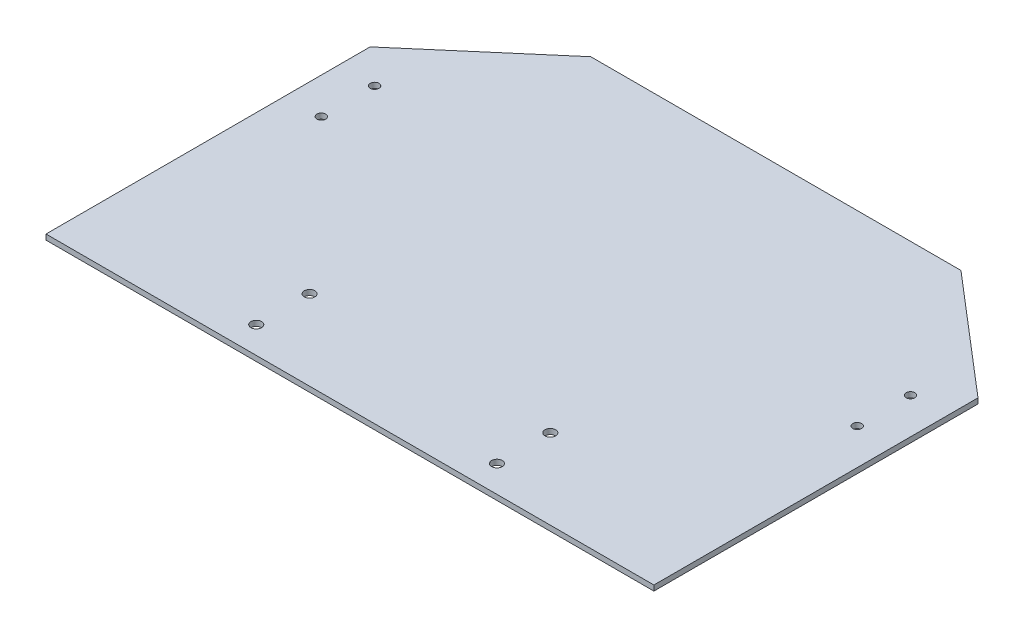
ISO-10303-21;
HEADER;
FILE_DESCRIPTION(('STEP AP214'),'2;1');
FILE_NAME('part.step','',(''),(''),'','','');
FILE_SCHEMA(('AUTOMOTIVE_DESIGN { 1 0 10303 214 1 1 1 1 }'));
ENDSEC;
DATA;
#1=APPLICATION_CONTEXT('core data for automotive mechanical design processes');
#2=APPLICATION_PROTOCOL_DEFINITION('international standard','automotive_design',2000,#1);
#3=PRODUCT_CONTEXT('',#1,'mechanical');
#4=PRODUCT('Part','Part','',(#3));
#5=PRODUCT_RELATED_PRODUCT_CATEGORY('part','',(#4));
#6=PRODUCT_DEFINITION_FORMATION('','',#4);
#7=PRODUCT_DEFINITION_CONTEXT('part definition',#1,'design');
#8=PRODUCT_DEFINITION('design','',#6,#7);
#9=PRODUCT_DEFINITION_SHAPE('','',#8);
#10=(LENGTH_UNIT() NAMED_UNIT(*) SI_UNIT(.MILLI.,.METRE.));
#11=(NAMED_UNIT(*) PLANE_ANGLE_UNIT() SI_UNIT($,.RADIAN.));
#12=(NAMED_UNIT(*) SI_UNIT($,.STERADIAN.) SOLID_ANGLE_UNIT());
#13=UNCERTAINTY_MEASURE_WITH_UNIT(LENGTH_MEASURE(1.E-05),#10,'distance_accuracy_value','');
#14=(GEOMETRIC_REPRESENTATION_CONTEXT(3) GLOBAL_UNCERTAINTY_ASSIGNED_CONTEXT((#13)) GLOBAL_UNIT_ASSIGNED_CONTEXT((#10,
#11,#12)) REPRESENTATION_CONTEXT('',''));
#15=CARTESIAN_POINT('',(0.,0.,0.));
#16=DIRECTION('',(0.,0.,1.));
#17=DIRECTION('',(1.,0.,0.));
#18=AXIS2_PLACEMENT_3D('',#15,#16,#17);
#19=CARTESIAN_POINT('',(0.,2.,-79.875));
#20=DIRECTION('',(0.,0.,-1.));
#21=DIRECTION('',(-1.,0.,0.));
#22=AXIS2_PLACEMENT_3D('',#19,#20,#21);
#23=PLANE('',#22);
#24=DIRECTION('',(1.,0.,0.));
#25=VECTOR('',#24,1.);
#26=CARTESIAN_POINT('',(0.,0.,-79.875));
#27=LINE('',#26,#25);
#28=CARTESIAN_POINT('',(-69.415,0.,-79.875));
#29=VERTEX_POINT('',#28);
#30=CARTESIAN_POINT('',(69.415,0.,-79.875));
#31=VERTEX_POINT('',#30);
#32=EDGE_CURVE('E128',#29,#31,#27,.T.);
#33=ORIENTED_EDGE('',*,*,#32,.F.);
#34=DIRECTION('',(0.,-1.,0.));
#35=VECTOR('',#34,1.);
#36=CARTESIAN_POINT('',(-69.415,2.,-79.875));
#37=LINE('',#36,#35);
#38=CARTESIAN_POINT('',(-69.415,2.,-79.875));
#39=VERTEX_POINT('',#38);
#40=EDGE_CURVE('E11',#39,#29,#37,.T.);
#41=ORIENTED_EDGE('',*,*,#40,.F.);
#42=DIRECTION('',(1.,0.,0.));
#43=VECTOR('',#42,1.);
#44=CARTESIAN_POINT('',(0.,2.,-79.875));
#45=LINE('',#44,#43);
#46=CARTESIAN_POINT('',(69.415,2.,-79.875));
#47=VERTEX_POINT('',#46);
#48=EDGE_CURVE('E137',#39,#47,#45,.T.);
#49=ORIENTED_EDGE('',*,*,#48,.T.);
#50=DIRECTION('',(0.,-1.,0.));
#51=VECTOR('',#50,1.);
#52=CARTESIAN_POINT('',(69.415,2.,-79.875));
#53=LINE('',#52,#51);
#54=EDGE_CURVE('E63',#47,#31,#53,.T.);
#55=ORIENTED_EDGE('',*,*,#54,.T.);
#56=EDGE_LOOP('',(#33,#41,#49,#55));
#57=FACE_BOUND('',#56,.T.);
#58=ADVANCED_FACE('F43',(#57),#23,.T.);
#59=CARTESIAN_POINT('',(-68.8400569146173,2.,-80.3674767619326));
#60=DIRECTION('',(0.650538829440786,0.,0.759472995826588));
#61=DIRECTION('',(0.759472995826588,0.,-0.650538829440786));
#62=AXIS2_PLACEMENT_3D('',#59,#60,#61);
#63=PLANE('',#62);
#64=DIRECTION('',(-0.759472995826588,0.,0.650538829440786));
#65=VECTOR('',#64,1.);
#66=CARTESIAN_POINT('',(-68.8400569146173,0.,-80.3674767619326));
#67=LINE('',#66,#65);
#68=CARTESIAN_POINT('',(-114.,0.,-41.6849999999999));
#69=VERTEX_POINT('',#68);
#70=EDGE_CURVE('E127',#29,#69,#67,.T.);
#71=ORIENTED_EDGE('',*,*,#70,.T.);
#72=DIRECTION('',(0.,-1.,0.));
#73=VECTOR('',#72,1.);
#74=CARTESIAN_POINT('',(-114.,2.,-41.6849999999999));
#75=LINE('',#74,#73);
#76=CARTESIAN_POINT('',(-114.,2.,-41.6849999999999));
#77=VERTEX_POINT('',#76);
#78=EDGE_CURVE('E55',#77,#69,#75,.T.);
#79=ORIENTED_EDGE('',*,*,#78,.F.);
#80=DIRECTION('',(-0.759472995826588,0.,0.650538829440786));
#81=VECTOR('',#80,1.);
#82=CARTESIAN_POINT('',(-68.8400569146173,2.,-80.3674767619326));
#83=LINE('',#82,#81);
#84=EDGE_CURVE('E206',#39,#77,#83,.T.);
#85=ORIENTED_EDGE('',*,*,#84,.F.);
#86=ORIENTED_EDGE('',*,*,#40,.T.);
#87=EDGE_LOOP('',(#71,#79,#85,#86));
#88=FACE_BOUND('',#87,.T.);
#89=ADVANCED_FACE('F179',(#88),#63,.F.);
#90=CARTESIAN_POINT('',(-114.,2.,0.));
#91=DIRECTION('',(-1.,0.,0.));
#92=DIRECTION('',(0.,0.,1.));
#93=AXIS2_PLACEMENT_3D('',#90,#91,#92);
#94=PLANE('',#93);
#95=DIRECTION('',(0.,0.,-1.));
#96=VECTOR('',#95,1.);
#97=CARTESIAN_POINT('',(-114.,0.,0.));
#98=LINE('',#97,#96);
#99=CARTESIAN_POINT('',(-114.,0.,79.875));
#100=VERTEX_POINT('',#99);
#101=EDGE_CURVE('E131',#100,#69,#98,.T.);
#102=ORIENTED_EDGE('',*,*,#101,.F.);
#103=DIRECTION('',(0.,-1.,0.));
#104=VECTOR('',#103,1.);
#105=CARTESIAN_POINT('',(-114.,2.,79.875));
#106=LINE('',#105,#104);
#107=CARTESIAN_POINT('',(-114.,2.,79.875));
#108=VERTEX_POINT('',#107);
#109=EDGE_CURVE('E117',#108,#100,#106,.T.);
#110=ORIENTED_EDGE('',*,*,#109,.F.);
#111=DIRECTION('',(0.,0.,-1.));
#112=VECTOR('',#111,1.);
#113=CARTESIAN_POINT('',(-114.,2.,0.));
#114=LINE('',#113,#112);
#115=EDGE_CURVE('E108',#108,#77,#114,.T.);
#116=ORIENTED_EDGE('',*,*,#115,.T.);
#117=ORIENTED_EDGE('',*,*,#78,.T.);
#118=EDGE_LOOP('',(#102,#110,#116,#117));
#119=FACE_BOUND('',#118,.T.);
#120=ADVANCED_FACE('F183',(#119),#94,.T.);
#121=CARTESIAN_POINT('',(0.,2.,79.875));
#122=DIRECTION('',(0.,0.,-1.));
#123=DIRECTION('',(-1.,0.,0.));
#124=AXIS2_PLACEMENT_3D('',#121,#122,#123);
#125=PLANE('',#124);
#126=DIRECTION('',(1.,0.,0.));
#127=VECTOR('',#126,1.);
#128=CARTESIAN_POINT('',(0.,0.,79.875));
#129=LINE('',#128,#127);
#130=CARTESIAN_POINT('',(114.,0.,79.875));
#131=VERTEX_POINT('',#130);
#132=EDGE_CURVE('E114',#100,#131,#129,.T.);
#133=ORIENTED_EDGE('',*,*,#132,.T.);
#134=DIRECTION('',(0.,-1.,0.));
#135=VECTOR('',#134,1.);
#136=CARTESIAN_POINT('',(114.,2.,79.875));
#137=LINE('',#136,#135);
#138=CARTESIAN_POINT('',(114.,2.,79.875));
#139=VERTEX_POINT('',#138);
#140=EDGE_CURVE('E115',#139,#131,#137,.T.);
#141=ORIENTED_EDGE('',*,*,#140,.F.);
#142=DIRECTION('',(1.,0.,0.));
#143=VECTOR('',#142,1.);
#144=CARTESIAN_POINT('',(0.,2.,79.875));
#145=LINE('',#144,#143);
#146=EDGE_CURVE('E99',#108,#139,#145,.T.);
#147=ORIENTED_EDGE('',*,*,#146,.F.);
#148=ORIENTED_EDGE('',*,*,#109,.T.);
#149=EDGE_LOOP('',(#133,#141,#147,#148));
#150=FACE_BOUND('',#149,.T.);
#151=ADVANCED_FACE('F113',(#150),#125,.F.);
#152=CARTESIAN_POINT('',(114.,2.,0.));
#153=DIRECTION('',(-1.,0.,0.));
#154=DIRECTION('',(0.,0.,1.));
#155=AXIS2_PLACEMENT_3D('',#152,#153,#154);
#156=PLANE('',#155);
#157=DIRECTION('',(0.,0.,-1.));
#158=VECTOR('',#157,1.);
#159=CARTESIAN_POINT('',(114.,0.,0.));
#160=LINE('',#159,#158);
#161=CARTESIAN_POINT('',(114.,0.,-41.685));
#162=VERTEX_POINT('',#161);
#163=EDGE_CURVE('E134',#131,#162,#160,.T.);
#164=ORIENTED_EDGE('',*,*,#163,.T.);
#165=DIRECTION('',(0.,-1.,0.));
#166=VECTOR('',#165,1.);
#167=CARTESIAN_POINT('',(114.,2.,-41.685));
#168=LINE('',#167,#166);
#169=CARTESIAN_POINT('',(114.,2.,-41.685));
#170=VERTEX_POINT('',#169);
#171=EDGE_CURVE('E83',#170,#162,#168,.T.);
#172=ORIENTED_EDGE('',*,*,#171,.F.);
#173=DIRECTION('',(0.,0.,-1.));
#174=VECTOR('',#173,1.);
#175=CARTESIAN_POINT('',(114.,2.,0.));
#176=LINE('',#175,#174);
#177=EDGE_CURVE('E106',#139,#170,#176,.T.);
#178=ORIENTED_EDGE('',*,*,#177,.F.);
#179=ORIENTED_EDGE('',*,*,#140,.T.);
#180=EDGE_LOOP('',(#164,#172,#178,#179));
#181=FACE_BOUND('',#180,.T.);
#182=ADVANCED_FACE('F119',(#181),#156,.F.);
#183=CARTESIAN_POINT('',(68.8400569146173,2.,-80.3674767619326));
#184=DIRECTION('',(0.650538829440786,0.,-0.759472995826588));
#185=DIRECTION('',(-0.759472995826588,0.,-0.650538829440786));
#186=AXIS2_PLACEMENT_3D('',#183,#184,#185);
#187=PLANE('',#186);
#188=DIRECTION('',(0.759472995826588,0.,0.650538829440786));
#189=VECTOR('',#188,1.);
#190=CARTESIAN_POINT('',(68.8400569146173,0.,-80.3674767619326));
#191=LINE('',#190,#189);
#192=EDGE_CURVE('E140',#31,#162,#191,.T.);
#193=ORIENTED_EDGE('',*,*,#192,.F.);
#194=ORIENTED_EDGE('',*,*,#54,.F.);
#195=DIRECTION('',(0.759472995826588,0.,0.650538829440786));
#196=VECTOR('',#195,1.);
#197=CARTESIAN_POINT('',(68.8400569146173,2.,-80.3674767619326));
#198=LINE('',#197,#196);
#199=EDGE_CURVE('E122',#47,#170,#198,.T.);
#200=ORIENTED_EDGE('',*,*,#199,.T.);
#201=ORIENTED_EDGE('',*,*,#171,.T.);
#202=EDGE_LOOP('',(#193,#194,#200,#201));
#203=FACE_BOUND('',#202,.T.);
#204=ADVANCED_FACE('F189',(#203),#187,.T.);
#205=CARTESIAN_POINT('',(0.,2.,0.));
#206=DIRECTION('',(0.,1.,0.));
#207=DIRECTION('',(0.,0.,1.));
#208=AXIS2_PLACEMENT_3D('',#205,#206,#207);
#209=PLANE('',#208);
#210=CARTESIAN_POINT('',(100.499999999999,2.,-9.87699826613501));
#211=DIRECTION('',(0.,1.,0.));
#212=DIRECTION('',(0.,0.,1.));
#213=AXIS2_PLACEMENT_3D('',#210,#211,#212);
#214=CIRCLE('',#213,1.64999999999999);
#215=CARTESIAN_POINT('',(100.499999999999,2.,-8.22699826613502));
#216=VERTEX_POINT('',#215);
#217=EDGE_CURVE('E228',#216,#216,#214,.T.);
#218=ORIENTED_EDGE('',*,*,#217,.F.);
#219=EDGE_LOOP('',(#218));
#220=FACE_BOUND('',#219,.T.);
#221=CARTESIAN_POINT('',(-100.500000000001,2.,-29.876998266135));
#222=DIRECTION('',(0.,1.,0.));
#223=DIRECTION('',(0.,0.,1.));
#224=AXIS2_PLACEMENT_3D('',#221,#222,#223);
#225=CIRCLE('',#224,1.65);
#226=CARTESIAN_POINT('',(-100.500000000001,2.,-28.226998266135));
#227=VERTEX_POINT('',#226);
#228=EDGE_CURVE('E235',#227,#227,#225,.T.);
#229=ORIENTED_EDGE('',*,*,#228,.F.);
#230=EDGE_LOOP('',(#229));
#231=FACE_BOUND('',#230,.T.);
#232=CARTESIAN_POINT('',(-100.500000000001,2.,-9.87699826613501));
#233=DIRECTION('',(0.,1.,0.));
#234=DIRECTION('',(0.,0.,1.));
#235=AXIS2_PLACEMENT_3D('',#232,#233,#234);
#236=CIRCLE('',#235,1.64999999999999);
#237=CARTESIAN_POINT('',(-100.500000000001,2.,-8.22699826613503));
#238=VERTEX_POINT('',#237);
#239=EDGE_CURVE('E231',#238,#238,#236,.T.);
#240=ORIENTED_EDGE('',*,*,#239,.F.);
#241=EDGE_LOOP('',(#240));
#242=FACE_BOUND('',#241,.T.);
#243=CARTESIAN_POINT('',(100.499999999999,2.,-29.876998266135));
#244=DIRECTION('',(0.,1.,0.));
#245=DIRECTION('',(0.,0.,1.));
#246=AXIS2_PLACEMENT_3D('',#243,#244,#245);
#247=CIRCLE('',#246,1.64999999999999);
#248=CARTESIAN_POINT('',(100.499999999999,2.,-28.226998266135));
#249=VERTEX_POINT('',#248);
#250=EDGE_CURVE('E221',#249,#249,#247,.T.);
#251=ORIENTED_EDGE('',*,*,#250,.F.);
#252=EDGE_LOOP('',(#251));
#253=FACE_BOUND('',#252,.T.);
#254=CARTESIAN_POINT('',(45.14,2.,69.875));
#255=DIRECTION('',(0.,1.,0.));
#256=DIRECTION('',(0.,0.,1.));
#257=AXIS2_PLACEMENT_3D('',#254,#255,#256);
#258=CIRCLE('',#257,2.);
#259=CARTESIAN_POINT('',(45.14,2.,71.8750000000001));
#260=VERTEX_POINT('',#259);
#261=EDGE_CURVE('E215',#260,#260,#258,.T.);
#262=ORIENTED_EDGE('',*,*,#261,.F.);
#263=EDGE_LOOP('',(#262));
#264=FACE_BOUND('',#263,.T.);
#265=CARTESIAN_POINT('',(-45.1400000000012,2.,49.8749999999996));
#266=DIRECTION('',(0.,1.,0.));
#267=DIRECTION('',(0.,0.,1.));
#268=AXIS2_PLACEMENT_3D('',#265,#266,#267);
#269=CIRCLE('',#268,2.);
#270=CARTESIAN_POINT('',(-45.1400000000012,2.,51.8749999999996));
#271=VERTEX_POINT('',#270);
#272=EDGE_CURVE('E211',#271,#271,#269,.T.);
#273=ORIENTED_EDGE('',*,*,#272,.F.);
#274=EDGE_LOOP('',(#273));
#275=FACE_BOUND('',#274,.T.);
#276=CARTESIAN_POINT('',(45.1400000000015,2.,49.8749999999994));
#277=DIRECTION('',(0.,1.,0.));
#278=DIRECTION('',(0.,0.,-1.));
#279=AXIS2_PLACEMENT_3D('',#276,#277,#278);
#280=CIRCLE('',#279,2.);
#281=CARTESIAN_POINT('',(45.1400000000015,2.,47.8749999999994));
#282=VERTEX_POINT('',#281);
#283=EDGE_CURVE('E217',#282,#282,#280,.T.);
#284=ORIENTED_EDGE('',*,*,#283,.F.);
#285=EDGE_LOOP('',(#284));
#286=FACE_BOUND('',#285,.T.);
#287=CARTESIAN_POINT('',(-45.14,2.,69.875));
#288=DIRECTION('',(0.,1.,0.));
#289=DIRECTION('',(0.,0.,1.));
#290=AXIS2_PLACEMENT_3D('',#287,#288,#289);
#291=CIRCLE('',#290,2.);
#292=CARTESIAN_POINT('',(-45.14,2.,71.8750000000001));
#293=VERTEX_POINT('',#292);
#294=EDGE_CURVE('E150',#293,#293,#291,.T.);
#295=ORIENTED_EDGE('',*,*,#294,.F.);
#296=EDGE_LOOP('',(#295));
#297=FACE_BOUND('',#296,.T.);
#298=ORIENTED_EDGE('',*,*,#48,.F.);
#299=ORIENTED_EDGE('',*,*,#84,.T.);
#300=ORIENTED_EDGE('',*,*,#115,.F.);
#301=ORIENTED_EDGE('',*,*,#146,.T.);
#302=ORIENTED_EDGE('',*,*,#177,.T.);
#303=ORIENTED_EDGE('',*,*,#199,.F.);
#304=EDGE_LOOP('',(#298,#299,#300,#301,#302,#303));
#305=FACE_BOUND('',#304,.T.);
#306=ADVANCED_FACE('F101',(#220,#231,#242,#253,#264,#275,#286,#297,#305),#209,.T.);
#307=CARTESIAN_POINT('',(0.,0.,0.));
#308=DIRECTION('',(0.,1.,0.));
#309=DIRECTION('',(0.,0.,1.));
#310=AXIS2_PLACEMENT_3D('',#307,#308,#309);
#311=PLANE('',#310);
#312=CARTESIAN_POINT('',(100.499999999999,0.,-9.87699826613501));
#313=DIRECTION('',(0.,1.,0.));
#314=DIRECTION('',(0.,0.,1.));
#315=AXIS2_PLACEMENT_3D('',#312,#313,#314);
#316=CIRCLE('',#315,1.64999999999999);
#317=CARTESIAN_POINT('',(100.499999999999,0.,-8.22699826613502));
#318=VERTEX_POINT('',#317);
#319=EDGE_CURVE('E236',#318,#318,#316,.T.);
#320=ORIENTED_EDGE('',*,*,#319,.T.);
#321=EDGE_LOOP('',(#320));
#322=FACE_BOUND('',#321,.T.);
#323=CARTESIAN_POINT('',(-100.500000000001,0.,-29.876998266135));
#324=DIRECTION('',(0.,1.,0.));
#325=DIRECTION('',(0.,0.,1.));
#326=AXIS2_PLACEMENT_3D('',#323,#324,#325);
#327=CIRCLE('',#326,1.65);
#328=CARTESIAN_POINT('',(-100.500000000001,0.,-28.226998266135));
#329=VERTEX_POINT('',#328);
#330=EDGE_CURVE('E230',#329,#329,#327,.T.);
#331=ORIENTED_EDGE('',*,*,#330,.T.);
#332=EDGE_LOOP('',(#331));
#333=FACE_BOUND('',#332,.T.);
#334=CARTESIAN_POINT('',(-100.500000000001,0.,-9.87699826613501));
#335=DIRECTION('',(0.,1.,0.));
#336=DIRECTION('',(0.,0.,1.));
#337=AXIS2_PLACEMENT_3D('',#334,#335,#336);
#338=CIRCLE('',#337,1.64999999999999);
#339=CARTESIAN_POINT('',(-100.500000000001,0.,-8.22699826613503));
#340=VERTEX_POINT('',#339);
#341=EDGE_CURVE('E241',#340,#340,#338,.T.);
#342=ORIENTED_EDGE('',*,*,#341,.T.);
#343=EDGE_LOOP('',(#342));
#344=FACE_BOUND('',#343,.T.);
#345=CARTESIAN_POINT('',(100.499999999999,0.,-29.876998266135));
#346=DIRECTION('',(0.,1.,0.));
#347=DIRECTION('',(0.,0.,1.));
#348=AXIS2_PLACEMENT_3D('',#345,#346,#347);
#349=CIRCLE('',#348,1.64999999999999);
#350=CARTESIAN_POINT('',(100.499999999999,0.,-28.226998266135));
#351=VERTEX_POINT('',#350);
#352=EDGE_CURVE('E225',#351,#351,#349,.T.);
#353=ORIENTED_EDGE('',*,*,#352,.T.);
#354=EDGE_LOOP('',(#353));
#355=FACE_BOUND('',#354,.T.);
#356=CARTESIAN_POINT('',(45.14,0.,69.875));
#357=DIRECTION('',(0.,1.,0.));
#358=DIRECTION('',(0.,0.,1.));
#359=AXIS2_PLACEMENT_3D('',#356,#357,#358);
#360=CIRCLE('',#359,2.);
#361=CARTESIAN_POINT('',(45.14,0.,71.8750000000001));
#362=VERTEX_POINT('',#361);
#363=EDGE_CURVE('E46',#362,#362,#360,.T.);
#364=ORIENTED_EDGE('',*,*,#363,.T.);
#365=EDGE_LOOP('',(#364));
#366=FACE_BOUND('',#365,.T.);
#367=CARTESIAN_POINT('',(-45.1400000000012,0.,49.8749999999996));
#368=DIRECTION('',(0.,1.,0.));
#369=DIRECTION('',(0.,0.,1.));
#370=AXIS2_PLACEMENT_3D('',#367,#368,#369);
#371=CIRCLE('',#370,2.);
#372=CARTESIAN_POINT('',(-45.1400000000012,0.,51.8749999999996));
#373=VERTEX_POINT('',#372);
#374=EDGE_CURVE('E151',#373,#373,#371,.T.);
#375=ORIENTED_EDGE('',*,*,#374,.T.);
#376=EDGE_LOOP('',(#375));
#377=FACE_BOUND('',#376,.T.);
#378=CARTESIAN_POINT('',(45.1400000000015,0.,49.8749999999994));
#379=DIRECTION('',(0.,1.,0.));
#380=DIRECTION('',(0.,0.,1.));
#381=AXIS2_PLACEMENT_3D('',#378,#379,#380);
#382=CIRCLE('',#381,2.);
#383=CARTESIAN_POINT('',(45.1400000000015,0.,51.8749999999994));
#384=VERTEX_POINT('',#383);
#385=EDGE_CURVE('E147',#384,#384,#382,.T.);
#386=ORIENTED_EDGE('',*,*,#385,.T.);
#387=EDGE_LOOP('',(#386));
#388=FACE_BOUND('',#387,.T.);
#389=CARTESIAN_POINT('',(-45.14,0.,69.875));
#390=DIRECTION('',(0.,1.,0.));
#391=DIRECTION('',(0.,0.,1.));
#392=AXIS2_PLACEMENT_3D('',#389,#390,#391);
#393=CIRCLE('',#392,2.);
#394=CARTESIAN_POINT('',(-45.14,0.,71.8750000000001));
#395=VERTEX_POINT('',#394);
#396=EDGE_CURVE('E143',#395,#395,#393,.T.);
#397=ORIENTED_EDGE('',*,*,#396,.T.);
#398=EDGE_LOOP('',(#397));
#399=FACE_BOUND('',#398,.T.);
#400=ORIENTED_EDGE('',*,*,#32,.T.);
#401=ORIENTED_EDGE('',*,*,#192,.T.);
#402=ORIENTED_EDGE('',*,*,#163,.F.);
#403=ORIENTED_EDGE('',*,*,#132,.F.);
#404=ORIENTED_EDGE('',*,*,#101,.T.);
#405=ORIENTED_EDGE('',*,*,#70,.F.);
#406=EDGE_LOOP('',(#400,#401,#402,#403,#404,#405));
#407=FACE_BOUND('',#406,.T.);
#408=ADVANCED_FACE('F156',(#322,#333,#344,#355,#366,#377,#388,#399,#407),#311,.F.);
#409=CARTESIAN_POINT('',(-45.14,-8.,69.875));
#410=DIRECTION('',(0.,1.,0.));
#411=DIRECTION('',(0.,0.,1.));
#412=AXIS2_PLACEMENT_3D('',#409,#410,#411);
#413=CYLINDRICAL_SURFACE('',#412,2.);
#414=ORIENTED_EDGE('',*,*,#294,.T.);
#415=EDGE_LOOP('',(#414));
#416=FACE_BOUND('',#415,.T.);
#417=ORIENTED_EDGE('',*,*,#396,.F.);
#418=EDGE_LOOP('',(#417));
#419=FACE_BOUND('',#418,.T.);
#420=ADVANCED_FACE('F260',(#416,#419),#413,.F.);
#421=CARTESIAN_POINT('',(45.1400000000015,-8.,49.8749999999994));
#422=DIRECTION('',(0.,1.,0.));
#423=DIRECTION('',(0.,0.,1.));
#424=AXIS2_PLACEMENT_3D('',#421,#422,#423);
#425=CYLINDRICAL_SURFACE('',#424,2.);
#426=ORIENTED_EDGE('',*,*,#283,.T.);
#427=EDGE_LOOP('',(#426));
#428=FACE_BOUND('',#427,.T.);
#429=ORIENTED_EDGE('',*,*,#385,.F.);
#430=EDGE_LOOP('',(#429));
#431=FACE_BOUND('',#430,.T.);
#432=ADVANCED_FACE('F172',(#428,#431),#425,.F.);
#433=CARTESIAN_POINT('',(-45.1400000000012,-8.,49.8749999999996));
#434=DIRECTION('',(0.,1.,0.));
#435=DIRECTION('',(0.,0.,1.));
#436=AXIS2_PLACEMENT_3D('',#433,#434,#435);
#437=CYLINDRICAL_SURFACE('',#436,2.);
#438=ORIENTED_EDGE('',*,*,#272,.T.);
#439=EDGE_LOOP('',(#438));
#440=FACE_BOUND('',#439,.T.);
#441=ORIENTED_EDGE('',*,*,#374,.F.);
#442=EDGE_LOOP('',(#441));
#443=FACE_BOUND('',#442,.T.);
#444=ADVANCED_FACE('F161',(#440,#443),#437,.F.);
#445=CARTESIAN_POINT('',(45.14,-8.,69.875));
#446=DIRECTION('',(0.,1.,0.));
#447=DIRECTION('',(0.,0.,1.));
#448=AXIS2_PLACEMENT_3D('',#445,#446,#447);
#449=CYLINDRICAL_SURFACE('',#448,2.);
#450=ORIENTED_EDGE('',*,*,#261,.T.);
#451=EDGE_LOOP('',(#450));
#452=FACE_BOUND('',#451,.T.);
#453=ORIENTED_EDGE('',*,*,#363,.F.);
#454=EDGE_LOOP('',(#453));
#455=FACE_BOUND('',#454,.T.);
#456=ADVANCED_FACE('F157',(#452,#455),#449,.F.);
#457=CARTESIAN_POINT('',(100.499999999999,0.,-29.876998266135));
#458=DIRECTION('',(0.,1.,0.));
#459=DIRECTION('',(0.,0.,1.));
#460=AXIS2_PLACEMENT_3D('',#457,#458,#459);
#461=CYLINDRICAL_SURFACE('',#460,1.64999999999999);
#462=ORIENTED_EDGE('',*,*,#352,.F.);
#463=EDGE_LOOP('',(#462));
#464=FACE_BOUND('',#463,.T.);
#465=ORIENTED_EDGE('',*,*,#250,.T.);
#466=EDGE_LOOP('',(#465));
#467=FACE_BOUND('',#466,.T.);
#468=ADVANCED_FACE('F162',(#464,#467),#461,.F.);
#469=CARTESIAN_POINT('',(-100.500000000001,0.,-9.87699826613501));
#470=DIRECTION('',(0.,1.,0.));
#471=DIRECTION('',(0.,0.,1.));
#472=AXIS2_PLACEMENT_3D('',#469,#470,#471);
#473=CYLINDRICAL_SURFACE('',#472,1.64999999999999);
#474=ORIENTED_EDGE('',*,*,#341,.F.);
#475=EDGE_LOOP('',(#474));
#476=FACE_BOUND('',#475,.T.);
#477=ORIENTED_EDGE('',*,*,#239,.T.);
#478=EDGE_LOOP('',(#477));
#479=FACE_BOUND('',#478,.T.);
#480=ADVANCED_FACE('F171',(#476,#479),#473,.F.);
#481=CARTESIAN_POINT('',(-100.500000000001,0.,-29.876998266135));
#482=DIRECTION('',(0.,1.,0.));
#483=DIRECTION('',(0.,0.,1.));
#484=AXIS2_PLACEMENT_3D('',#481,#482,#483);
#485=CYLINDRICAL_SURFACE('',#484,1.65);
#486=ORIENTED_EDGE('',*,*,#330,.F.);
#487=EDGE_LOOP('',(#486));
#488=FACE_BOUND('',#487,.T.);
#489=ORIENTED_EDGE('',*,*,#228,.T.);
#490=EDGE_LOOP('',(#489));
#491=FACE_BOUND('',#490,.T.);
#492=ADVANCED_FACE('F277',(#488,#491),#485,.F.);
#493=CARTESIAN_POINT('',(100.499999999999,0.,-9.87699826613501));
#494=DIRECTION('',(0.,1.,0.));
#495=DIRECTION('',(0.,0.,1.));
#496=AXIS2_PLACEMENT_3D('',#493,#494,#495);
#497=CYLINDRICAL_SURFACE('',#496,1.64999999999999);
#498=ORIENTED_EDGE('',*,*,#319,.F.);
#499=EDGE_LOOP('',(#498));
#500=FACE_BOUND('',#499,.T.);
#501=ORIENTED_EDGE('',*,*,#217,.T.);
#502=EDGE_LOOP('',(#501));
#503=FACE_BOUND('',#502,.T.);
#504=ADVANCED_FACE('F282',(#500,#503),#497,.F.);
#505=CLOSED_SHELL('',(#58,#89,#120,#151,#182,#204,#306,#408,#420,#432,#444,#456,#468,#480,#492,#504));
#506=MANIFOLD_SOLID_BREP('B2',#505);
#507=ADVANCED_BREP_SHAPE_REPRESENTATION('',(#18,#506),#14);
#508=SHAPE_DEFINITION_REPRESENTATION(#9,#507);
ENDSEC;
END-ISO-10303-21;
